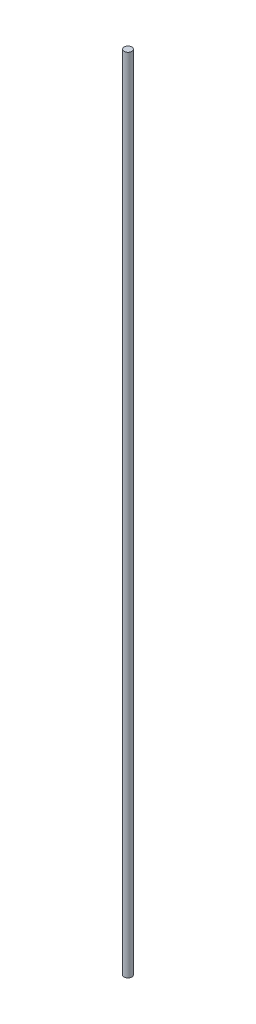
ISO-10303-21;
HEADER;
FILE_DESCRIPTION(('STEP AP214'),'2;1');
FILE_NAME('part.step','',(''),(''),'','','');
FILE_SCHEMA(('AUTOMOTIVE_DESIGN { 1 0 10303 214 1 1 1 1 }'));
ENDSEC;
DATA;
#1=APPLICATION_CONTEXT('core data for automotive mechanical design processes');
#2=APPLICATION_PROTOCOL_DEFINITION('international standard','automotive_design',2000,#1);
#3=PRODUCT_CONTEXT('',#1,'mechanical');
#4=PRODUCT('Part','Part','',(#3));
#5=PRODUCT_RELATED_PRODUCT_CATEGORY('part','',(#4));
#6=PRODUCT_DEFINITION_FORMATION('','',#4);
#7=PRODUCT_DEFINITION_CONTEXT('part definition',#1,'design');
#8=PRODUCT_DEFINITION('design','',#6,#7);
#9=PRODUCT_DEFINITION_SHAPE('','',#8);
#10=(LENGTH_UNIT() NAMED_UNIT(*) SI_UNIT(.MILLI.,.METRE.));
#11=(NAMED_UNIT(*) PLANE_ANGLE_UNIT() SI_UNIT($,.RADIAN.));
#12=(NAMED_UNIT(*) SI_UNIT($,.STERADIAN.) SOLID_ANGLE_UNIT());
#13=UNCERTAINTY_MEASURE_WITH_UNIT(LENGTH_MEASURE(1.E-05),#10,'distance_accuracy_value','');
#14=(GEOMETRIC_REPRESENTATION_CONTEXT(3) GLOBAL_UNCERTAINTY_ASSIGNED_CONTEXT((#13)) GLOBAL_UNIT_ASSIGNED_CONTEXT((#10,
#11,#12)) REPRESENTATION_CONTEXT('',''));
#15=CARTESIAN_POINT('',(0.,0.,0.));
#16=DIRECTION('',(0.,0.,1.));
#17=DIRECTION('',(1.,0.,0.));
#18=AXIS2_PLACEMENT_3D('',#15,#16,#17);
#19=CARTESIAN_POINT('',(0.,155.,0.));
#20=DIRECTION('',(0.,-1.,0.));
#21=DIRECTION('',(0.,0.,-1.));
#22=AXIS2_PLACEMENT_3D('',#19,#20,#21);
#23=CYLINDRICAL_SURFACE('',#22,0.75);
#24=CARTESIAN_POINT('',(0.,155.,0.));
#25=DIRECTION('',(0.,1.,0.));
#26=DIRECTION('',(0.,0.,1.));
#27=AXIS2_PLACEMENT_3D('',#24,#25,#26);
#28=CIRCLE('',#27,0.75);
#29=CARTESIAN_POINT('',(0.,155.,0.75));
#30=VERTEX_POINT('',#29);
#31=EDGE_CURVE('E10',#30,#30,#28,.T.);
#32=ORIENTED_EDGE('',*,*,#31,.F.);
#33=EDGE_LOOP('',(#32));
#34=FACE_BOUND('',#33,.T.);
#35=CARTESIAN_POINT('',(0.,0.,0.));
#36=DIRECTION('',(0.,1.,0.));
#37=DIRECTION('',(0.,0.,1.));
#38=AXIS2_PLACEMENT_3D('',#35,#36,#37);
#39=CIRCLE('',#38,0.75);
#40=CARTESIAN_POINT('',(0.,0.,0.75));
#41=VERTEX_POINT('',#40);
#42=EDGE_CURVE('E34',#41,#41,#39,.T.);
#43=ORIENTED_EDGE('',*,*,#42,.T.);
#44=EDGE_LOOP('',(#43));
#45=FACE_BOUND('',#44,.T.);
#46=ADVANCED_FACE('F31',(#34,#45),#23,.T.);
#47=CARTESIAN_POINT('',(0.,155.,0.));
#48=DIRECTION('',(0.,1.,0.));
#49=DIRECTION('',(0.,0.,1.));
#50=AXIS2_PLACEMENT_3D('',#47,#48,#49);
#51=PLANE('',#50);
#52=ORIENTED_EDGE('',*,*,#31,.T.);
#53=EDGE_LOOP('',(#52));
#54=FACE_BOUND('',#53,.T.);
#55=ADVANCED_FACE('F46',(#54),#51,.T.);
#56=CARTESIAN_POINT('',(0.,0.,0.));
#57=DIRECTION('',(0.,1.,0.));
#58=DIRECTION('',(0.,0.,1.));
#59=AXIS2_PLACEMENT_3D('',#56,#57,#58);
#60=PLANE('',#59);
#61=ORIENTED_EDGE('',*,*,#42,.F.);
#62=EDGE_LOOP('',(#61));
#63=FACE_BOUND('',#62,.T.);
#64=ADVANCED_FACE('F44',(#63),#60,.F.);
#65=CLOSED_SHELL('',(#46,#55,#64));
#66=MANIFOLD_SOLID_BREP('B2',#65);
#67=ADVANCED_BREP_SHAPE_REPRESENTATION('',(#18,#66),#14);
#68=SHAPE_DEFINITION_REPRESENTATION(#9,#67);
ENDSEC;
END-ISO-10303-21;
